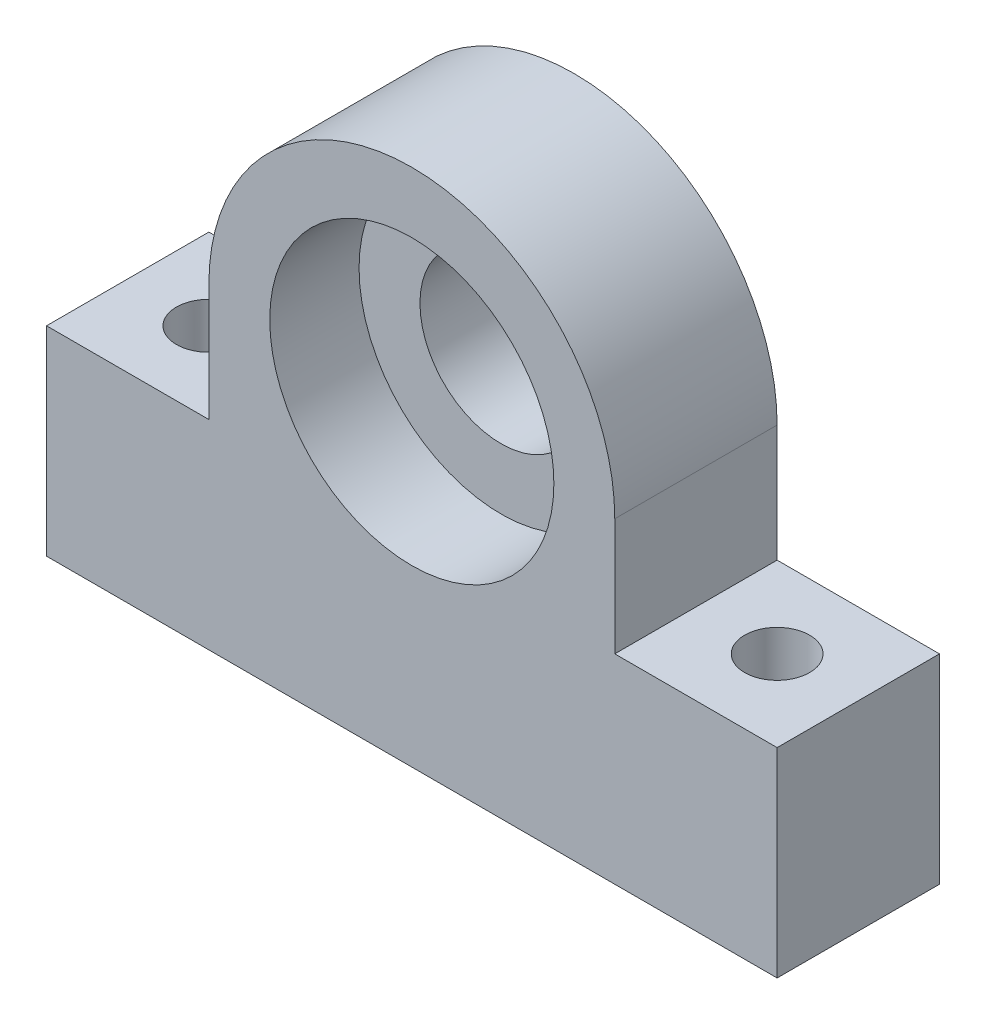
ISO-10303-21;
HEADER;
FILE_DESCRIPTION(('STEP AP214'),'2;1');
FILE_NAME('part.step','',(''),(''),'','','');
FILE_SCHEMA(('AUTOMOTIVE_DESIGN { 1 0 10303 214 1 1 1 1 }'));
ENDSEC;
DATA;
#1=APPLICATION_CONTEXT('core data for automotive mechanical design processes');
#2=APPLICATION_PROTOCOL_DEFINITION('international standard','automotive_design',2000,#1);
#3=PRODUCT_CONTEXT('',#1,'mechanical');
#4=PRODUCT('Part','Part','',(#3));
#5=PRODUCT_RELATED_PRODUCT_CATEGORY('part','',(#4));
#6=PRODUCT_DEFINITION_FORMATION('','',#4);
#7=PRODUCT_DEFINITION_CONTEXT('part definition',#1,'design');
#8=PRODUCT_DEFINITION('design','',#6,#7);
#9=PRODUCT_DEFINITION_SHAPE('','',#8);
#10=(LENGTH_UNIT() NAMED_UNIT(*) SI_UNIT(.MILLI.,.METRE.));
#11=(NAMED_UNIT(*) PLANE_ANGLE_UNIT() SI_UNIT($,.RADIAN.));
#12=(NAMED_UNIT(*) SI_UNIT($,.STERADIAN.) SOLID_ANGLE_UNIT());
#13=UNCERTAINTY_MEASURE_WITH_UNIT(LENGTH_MEASURE(1.E-05),#10,'distance_accuracy_value','');
#14=(GEOMETRIC_REPRESENTATION_CONTEXT(3) GLOBAL_UNCERTAINTY_ASSIGNED_CONTEXT((#13)) GLOBAL_UNIT_ASSIGNED_CONTEXT((#10,
#11,#12)) REPRESENTATION_CONTEXT('',''));
#15=CARTESIAN_POINT('',(0.,0.,0.));
#16=DIRECTION('',(0.,0.,1.));
#17=DIRECTION('',(1.,0.,0.));
#18=AXIS2_PLACEMENT_3D('',#15,#16,#17);
#19=CARTESIAN_POINT('',(0.,0.,20.));
#20=DIRECTION('',(0.,0.,-1.));
#21=DIRECTION('',(-1.,0.,0.));
#22=AXIS2_PLACEMENT_3D('',#19,#20,#21);
#23=CYLINDRICAL_SURFACE('',#22,17.5);
#24=CARTESIAN_POINT('',(0.,0.,20.));
#25=DIRECTION('',(0.,0.,1.));
#26=DIRECTION('',(1.,0.,0.));
#27=AXIS2_PLACEMENT_3D('',#24,#25,#26);
#28=CIRCLE('',#27,17.5);
#29=CARTESIAN_POINT('',(17.5,0.,20.));
#30=VERTEX_POINT('',#29);
#31=EDGE_CURVE('E159',#30,#30,#28,.T.);
#32=ORIENTED_EDGE('',*,*,#31,.T.);
#33=EDGE_LOOP('',(#32));
#34=FACE_BOUND('',#33,.T.);
#35=CARTESIAN_POINT('',(0.,0.,9.));
#36=DIRECTION('',(0.,0.,-1.));
#37=DIRECTION('',(-1.,0.,0.));
#38=AXIS2_PLACEMENT_3D('',#35,#36,#37);
#39=CIRCLE('',#38,17.5);
#40=CARTESIAN_POINT('',(-17.5,0.,9.));
#41=VERTEX_POINT('',#40);
#42=EDGE_CURVE('E143',#41,#41,#39,.T.);
#43=ORIENTED_EDGE('',*,*,#42,.T.);
#44=EDGE_LOOP('',(#43));
#45=FACE_BOUND('',#44,.T.);
#46=ADVANCED_FACE('F37',(#34,#45),#23,.F.);
#47=CARTESIAN_POINT('',(0.,0.,20.));
#48=DIRECTION('',(0.,0.,1.));
#49=DIRECTION('',(1.,0.,0.));
#50=AXIS2_PLACEMENT_3D('',#47,#48,#49);
#51=PLANE('',#50);
#52=CARTESIAN_POINT('',(0.,0.,20.));
#53=DIRECTION('',(0.,0.,1.));
#54=DIRECTION('',(1.,0.,0.));
#55=AXIS2_PLACEMENT_3D('',#52,#53,#54);
#56=CIRCLE('',#55,25.);
#57=CARTESIAN_POINT('',(25.,0.,20.));
#58=VERTEX_POINT('',#57);
#59=CARTESIAN_POINT('',(-25.,0.,20.));
#60=VERTEX_POINT('',#59);
#61=EDGE_CURVE('E11',#58,#60,#56,.T.);
#62=ORIENTED_EDGE('',*,*,#61,.T.);
#63=DIRECTION('',(0.,-1.,0.));
#64=VECTOR('',#63,1.);
#65=CARTESIAN_POINT('',(-25.,-14.4112582686057,20.));
#66=LINE('',#65,#64);
#67=CARTESIAN_POINT('',(-25.,-14.4112582686057,20.));
#68=VERTEX_POINT('',#67);
#69=EDGE_CURVE('E139',#60,#68,#66,.T.);
#70=ORIENTED_EDGE('',*,*,#69,.T.);
#71=DIRECTION('',(-1.,0.,0.));
#72=VECTOR('',#71,1.);
#73=CARTESIAN_POINT('',(-45.,-14.4112582686057,20.));
#74=LINE('',#73,#72);
#75=CARTESIAN_POINT('',(-45.,-14.4112582686057,20.));
#76=VERTEX_POINT('',#75);
#77=EDGE_CURVE('E142',#68,#76,#74,.T.);
#78=ORIENTED_EDGE('',*,*,#77,.T.);
#79=DIRECTION('',(0.,-1.,0.));
#80=VECTOR('',#79,1.);
#81=CARTESIAN_POINT('',(-45.,-38.9912582686057,20.));
#82=LINE('',#81,#80);
#83=CARTESIAN_POINT('',(-45.,-38.9912582686057,20.));
#84=VERTEX_POINT('',#83);
#85=EDGE_CURVE('E146',#76,#84,#82,.T.);
#86=ORIENTED_EDGE('',*,*,#85,.T.);
#87=DIRECTION('',(1.,0.,0.));
#88=VECTOR('',#87,1.);
#89=CARTESIAN_POINT('',(45.,-38.9912582686057,20.));
#90=LINE('',#89,#88);
#91=CARTESIAN_POINT('',(45.,-38.9912582686057,20.));
#92=VERTEX_POINT('',#91);
#93=EDGE_CURVE('E149',#84,#92,#90,.T.);
#94=ORIENTED_EDGE('',*,*,#93,.T.);
#95=DIRECTION('',(0.,1.,0.));
#96=VECTOR('',#95,1.);
#97=CARTESIAN_POINT('',(45.,-14.4112582686057,20.));
#98=LINE('',#97,#96);
#99=CARTESIAN_POINT('',(45.,-14.4112582686057,20.));
#100=VERTEX_POINT('',#99);
#101=EDGE_CURVE('E152',#92,#100,#98,.T.);
#102=ORIENTED_EDGE('',*,*,#101,.T.);
#103=DIRECTION('',(-1.,0.,0.));
#104=VECTOR('',#103,1.);
#105=CARTESIAN_POINT('',(25.,-14.4112582686057,20.));
#106=LINE('',#105,#104);
#107=CARTESIAN_POINT('',(25.,-14.4112582686057,20.));
#108=VERTEX_POINT('',#107);
#109=EDGE_CURVE('E115',#100,#108,#106,.T.);
#110=ORIENTED_EDGE('',*,*,#109,.T.);
#111=DIRECTION('',(0.,1.,0.));
#112=VECTOR('',#111,1.);
#113=CARTESIAN_POINT('',(25.,0.,20.));
#114=LINE('',#113,#112);
#115=EDGE_CURVE('E53',#108,#58,#114,.T.);
#116=ORIENTED_EDGE('',*,*,#115,.T.);
#117=EDGE_LOOP('',(#62,#70,#78,#86,#94,#102,#110,#116));
#118=FACE_BOUND('',#117,.T.);
#119=ORIENTED_EDGE('',*,*,#31,.F.);
#120=EDGE_LOOP('',(#119));
#121=FACE_BOUND('',#120,.T.);
#122=ADVANCED_FACE('F214',(#118,#121),#51,.T.);
#123=CARTESIAN_POINT('',(0.,0.,0.));
#124=DIRECTION('',(0.,0.,1.));
#125=DIRECTION('',(1.,0.,0.));
#126=AXIS2_PLACEMENT_3D('',#123,#124,#125);
#127=PLANE('',#126);
#128=CARTESIAN_POINT('',(0.,0.,0.));
#129=DIRECTION('',(0.,0.,1.));
#130=DIRECTION('',(1.,0.,0.));
#131=AXIS2_PLACEMENT_3D('',#128,#129,#130);
#132=CIRCLE('',#131,25.);
#133=CARTESIAN_POINT('',(25.,0.,0.));
#134=VERTEX_POINT('',#133);
#135=CARTESIAN_POINT('',(-25.,0.,0.));
#136=VERTEX_POINT('',#135);
#137=EDGE_CURVE('E46',#134,#136,#132,.T.);
#138=ORIENTED_EDGE('',*,*,#137,.F.);
#139=DIRECTION('',(0.,1.,0.));
#140=VECTOR('',#139,1.);
#141=CARTESIAN_POINT('',(25.,0.,0.));
#142=LINE('',#141,#140);
#143=CARTESIAN_POINT('',(25.,-14.4112582686057,0.));
#144=VERTEX_POINT('',#143);
#145=EDGE_CURVE('E61',#144,#134,#142,.T.);
#146=ORIENTED_EDGE('',*,*,#145,.F.);
#147=DIRECTION('',(-1.,0.,0.));
#148=VECTOR('',#147,1.);
#149=CARTESIAN_POINT('',(25.,-14.4112582686057,0.));
#150=LINE('',#149,#148);
#151=CARTESIAN_POINT('',(45.,-14.4112582686057,0.));
#152=VERTEX_POINT('',#151);
#153=EDGE_CURVE('E114',#152,#144,#150,.T.);
#154=ORIENTED_EDGE('',*,*,#153,.F.);
#155=DIRECTION('',(0.,1.,0.));
#156=VECTOR('',#155,1.);
#157=CARTESIAN_POINT('',(45.,-14.4112582686057,0.));
#158=LINE('',#157,#156);
#159=CARTESIAN_POINT('',(45.,-38.9912582686057,0.));
#160=VERTEX_POINT('',#159);
#161=EDGE_CURVE('E128',#160,#152,#158,.T.);
#162=ORIENTED_EDGE('',*,*,#161,.F.);
#163=DIRECTION('',(1.,0.,0.));
#164=VECTOR('',#163,1.);
#165=CARTESIAN_POINT('',(45.,-38.9912582686057,0.));
#166=LINE('',#165,#164);
#167=CARTESIAN_POINT('',(-45.,-38.9912582686057,0.));
#168=VERTEX_POINT('',#167);
#169=EDGE_CURVE('E132',#168,#160,#166,.T.);
#170=ORIENTED_EDGE('',*,*,#169,.F.);
#171=DIRECTION('',(0.,-1.,0.));
#172=VECTOR('',#171,1.);
#173=CARTESIAN_POINT('',(-45.,-38.9912582686057,0.));
#174=LINE('',#173,#172);
#175=CARTESIAN_POINT('',(-45.,-14.4112582686057,0.));
#176=VERTEX_POINT('',#175);
#177=EDGE_CURVE('E134',#176,#168,#174,.T.);
#178=ORIENTED_EDGE('',*,*,#177,.F.);
#179=DIRECTION('',(-1.,0.,0.));
#180=VECTOR('',#179,1.);
#181=CARTESIAN_POINT('',(-45.,-14.4112582686057,0.));
#182=LINE('',#181,#180);
#183=CARTESIAN_POINT('',(-25.,-14.4112582686057,0.));
#184=VERTEX_POINT('',#183);
#185=EDGE_CURVE('E188',#184,#176,#182,.T.);
#186=ORIENTED_EDGE('',*,*,#185,.F.);
#187=DIRECTION('',(0.,-1.,0.));
#188=VECTOR('',#187,1.);
#189=CARTESIAN_POINT('',(-25.,-14.4112582686057,0.));
#190=LINE('',#189,#188);
#191=EDGE_CURVE('E156',#136,#184,#190,.T.);
#192=ORIENTED_EDGE('',*,*,#191,.F.);
#193=EDGE_LOOP('',(#138,#146,#154,#162,#170,#178,#186,#192));
#194=FACE_BOUND('',#193,.T.);
#195=CARTESIAN_POINT('',(0.,0.,0.));
#196=DIRECTION('',(0.,0.,-1.));
#197=DIRECTION('',(-1.,0.,0.));
#198=AXIS2_PLACEMENT_3D('',#195,#196,#197);
#199=CIRCLE('',#198,10.);
#200=CARTESIAN_POINT('',(-10.,0.,0.));
#201=VERTEX_POINT('',#200);
#202=EDGE_CURVE('E177',#201,#201,#199,.T.);
#203=ORIENTED_EDGE('',*,*,#202,.F.);
#204=EDGE_LOOP('',(#203));
#205=FACE_BOUND('',#204,.T.);
#206=ADVANCED_FACE('F125',(#194,#205),#127,.F.);
#207=CARTESIAN_POINT('',(0.,0.,20.));
#208=DIRECTION('',(0.,0.,-1.));
#209=DIRECTION('',(-1.,0.,0.));
#210=AXIS2_PLACEMENT_3D('',#207,#208,#209);
#211=CYLINDRICAL_SURFACE('',#210,25.);
#212=ORIENTED_EDGE('',*,*,#61,.F.);
#213=DIRECTION('',(0.,0.,1.));
#214=VECTOR('',#213,1.);
#215=CARTESIAN_POINT('',(25.,0.,0.));
#216=LINE('',#215,#214);
#217=EDGE_CURVE('E157',#134,#58,#216,.T.);
#218=ORIENTED_EDGE('',*,*,#217,.F.);
#219=ORIENTED_EDGE('',*,*,#137,.T.);
#220=DIRECTION('',(0.,0.,1.));
#221=VECTOR('',#220,1.);
#222=CARTESIAN_POINT('',(-25.,0.,0.));
#223=LINE('',#222,#221);
#224=EDGE_CURVE('E97',#136,#60,#223,.T.);
#225=ORIENTED_EDGE('',*,*,#224,.T.);
#226=EDGE_LOOP('',(#212,#218,#219,#225));
#227=FACE_BOUND('',#226,.T.);
#228=ADVANCED_FACE('F39',(#227),#211,.T.);
#229=CARTESIAN_POINT('',(25.,0.,0.));
#230=DIRECTION('',(1.,0.,0.));
#231=DIRECTION('',(0.,1.,0.));
#232=AXIS2_PLACEMENT_3D('',#229,#230,#231);
#233=PLANE('',#232);
#234=ORIENTED_EDGE('',*,*,#115,.F.);
#235=DIRECTION('',(0.,0.,1.));
#236=VECTOR('',#235,1.);
#237=CARTESIAN_POINT('',(25.,-14.4112582686057,0.));
#238=LINE('',#237,#236);
#239=EDGE_CURVE('E90',#144,#108,#238,.T.);
#240=ORIENTED_EDGE('',*,*,#239,.F.);
#241=ORIENTED_EDGE('',*,*,#145,.T.);
#242=ORIENTED_EDGE('',*,*,#217,.T.);
#243=EDGE_LOOP('',(#234,#240,#241,#242));
#244=FACE_BOUND('',#243,.T.);
#245=ADVANCED_FACE('F203',(#244),#233,.T.);
#246=CARTESIAN_POINT('',(25.,-14.4112582686057,0.));
#247=DIRECTION('',(0.,1.,0.));
#248=DIRECTION('',(0.,0.,1.));
#249=AXIS2_PLACEMENT_3D('',#246,#247,#248);
#250=PLANE('',#249);
#251=CARTESIAN_POINT('',(35.,-14.4112582686057,10.));
#252=DIRECTION('',(0.,1.,0.));
#253=DIRECTION('',(0.,0.,1.));
#254=AXIS2_PLACEMENT_3D('',#251,#252,#253);
#255=CIRCLE('',#254,4.00000000000001);
#256=CARTESIAN_POINT('',(35.,-14.4112582686057,14.));
#257=VERTEX_POINT('',#256);
#258=EDGE_CURVE('E382',#257,#257,#255,.T.);
#259=ORIENTED_EDGE('',*,*,#258,.F.);
#260=EDGE_LOOP('',(#259));
#261=FACE_BOUND('',#260,.T.);
#262=ORIENTED_EDGE('',*,*,#109,.F.);
#263=DIRECTION('',(0.,0.,1.));
#264=VECTOR('',#263,1.);
#265=CARTESIAN_POINT('',(45.,-14.4112582686057,0.));
#266=LINE('',#265,#264);
#267=EDGE_CURVE('E111',#152,#100,#266,.T.);
#268=ORIENTED_EDGE('',*,*,#267,.F.);
#269=ORIENTED_EDGE('',*,*,#153,.T.);
#270=ORIENTED_EDGE('',*,*,#239,.T.);
#271=EDGE_LOOP('',(#262,#268,#269,#270));
#272=FACE_BOUND('',#271,.T.);
#273=ADVANCED_FACE('F113',(#261,#272),#250,.T.);
#274=CARTESIAN_POINT('',(45.,-14.4112582686057,0.));
#275=DIRECTION('',(1.,0.,0.));
#276=DIRECTION('',(0.,0.,-1.));
#277=AXIS2_PLACEMENT_3D('',#274,#275,#276);
#278=PLANE('',#277);
#279=ORIENTED_EDGE('',*,*,#101,.F.);
#280=DIRECTION('',(0.,0.,1.));
#281=VECTOR('',#280,1.);
#282=CARTESIAN_POINT('',(45.,-38.9912582686057,0.));
#283=LINE('',#282,#281);
#284=EDGE_CURVE('E120',#160,#92,#283,.T.);
#285=ORIENTED_EDGE('',*,*,#284,.F.);
#286=ORIENTED_EDGE('',*,*,#161,.T.);
#287=ORIENTED_EDGE('',*,*,#267,.T.);
#288=EDGE_LOOP('',(#279,#285,#286,#287));
#289=FACE_BOUND('',#288,.T.);
#290=ADVANCED_FACE('F131',(#289),#278,.T.);
#291=CARTESIAN_POINT('',(45.,-38.9912582686057,0.));
#292=DIRECTION('',(0.,-1.,0.));
#293=DIRECTION('',(1.,0.,0.));
#294=AXIS2_PLACEMENT_3D('',#291,#292,#293);
#295=PLANE('',#294);
#296=CARTESIAN_POINT('',(35.,-38.9912582686057,10.));
#297=DIRECTION('',(0.,-1.,0.));
#298=DIRECTION('',(1.,0.,0.));
#299=AXIS2_PLACEMENT_3D('',#296,#297,#298);
#300=CIRCLE('',#299,4.00000000000001);
#301=CARTESIAN_POINT('',(39.,-38.9912582686057,10.));
#302=VERTEX_POINT('',#301);
#303=EDGE_CURVE('E41',#302,#302,#300,.T.);
#304=ORIENTED_EDGE('',*,*,#303,.F.);
#305=EDGE_LOOP('',(#304));
#306=FACE_BOUND('',#305,.T.);
#307=CARTESIAN_POINT('',(-35.,-38.9912582686057,10.));
#308=DIRECTION('',(0.,-1.,0.));
#309=DIRECTION('',(1.,0.,0.));
#310=AXIS2_PLACEMENT_3D('',#307,#308,#309);
#311=CIRCLE('',#310,4.00000000000001);
#312=CARTESIAN_POINT('',(-31.,-38.9912582686057,10.));
#313=VERTEX_POINT('',#312);
#314=EDGE_CURVE('E184',#313,#313,#311,.T.);
#315=ORIENTED_EDGE('',*,*,#314,.F.);
#316=EDGE_LOOP('',(#315));
#317=FACE_BOUND('',#316,.T.);
#318=ORIENTED_EDGE('',*,*,#93,.F.);
#319=DIRECTION('',(0.,0.,1.));
#320=VECTOR('',#319,1.);
#321=CARTESIAN_POINT('',(-45.,-38.9912582686057,0.));
#322=LINE('',#321,#320);
#323=EDGE_CURVE('E162',#168,#84,#322,.T.);
#324=ORIENTED_EDGE('',*,*,#323,.F.);
#325=ORIENTED_EDGE('',*,*,#169,.T.);
#326=ORIENTED_EDGE('',*,*,#284,.T.);
#327=EDGE_LOOP('',(#318,#324,#325,#326));
#328=FACE_BOUND('',#327,.T.);
#329=ADVANCED_FACE('F253',(#306,#317,#328),#295,.T.);
#330=CARTESIAN_POINT('',(-45.,-38.9912582686057,0.));
#331=DIRECTION('',(-1.,0.,0.));
#332=DIRECTION('',(0.,-1.,0.));
#333=AXIS2_PLACEMENT_3D('',#330,#331,#332);
#334=PLANE('',#333);
#335=ORIENTED_EDGE('',*,*,#85,.F.);
#336=DIRECTION('',(0.,0.,1.));
#337=VECTOR('',#336,1.);
#338=CARTESIAN_POINT('',(-45.,-14.4112582686057,0.));
#339=LINE('',#338,#337);
#340=EDGE_CURVE('E164',#176,#76,#339,.T.);
#341=ORIENTED_EDGE('',*,*,#340,.F.);
#342=ORIENTED_EDGE('',*,*,#177,.T.);
#343=ORIENTED_EDGE('',*,*,#323,.T.);
#344=EDGE_LOOP('',(#335,#341,#342,#343));
#345=FACE_BOUND('',#344,.T.);
#346=ADVANCED_FACE('F194',(#345),#334,.T.);
#347=CARTESIAN_POINT('',(-45.,-14.4112582686057,0.));
#348=DIRECTION('',(0.,1.,0.));
#349=DIRECTION('',(0.,0.,1.));
#350=AXIS2_PLACEMENT_3D('',#347,#348,#349);
#351=PLANE('',#350);
#352=CARTESIAN_POINT('',(-35.,-14.4112582686057,10.));
#353=DIRECTION('',(0.,1.,0.));
#354=DIRECTION('',(0.,0.,-1.));
#355=AXIS2_PLACEMENT_3D('',#352,#353,#354);
#356=CIRCLE('',#355,4.00000000000001);
#357=CARTESIAN_POINT('',(-35.,-14.4112582686057,5.99999999999999));
#358=VERTEX_POINT('',#357);
#359=EDGE_CURVE('E384',#358,#358,#356,.T.);
#360=ORIENTED_EDGE('',*,*,#359,.F.);
#361=EDGE_LOOP('',(#360));
#362=FACE_BOUND('',#361,.T.);
#363=ORIENTED_EDGE('',*,*,#77,.F.);
#364=DIRECTION('',(0.,0.,1.));
#365=VECTOR('',#364,1.);
#366=CARTESIAN_POINT('',(-25.,-14.4112582686057,0.));
#367=LINE('',#366,#365);
#368=EDGE_CURVE('E166',#184,#68,#367,.T.);
#369=ORIENTED_EDGE('',*,*,#368,.F.);
#370=ORIENTED_EDGE('',*,*,#185,.T.);
#371=ORIENTED_EDGE('',*,*,#340,.T.);
#372=EDGE_LOOP('',(#363,#369,#370,#371));
#373=FACE_BOUND('',#372,.T.);
#374=ADVANCED_FACE('F199',(#362,#373),#351,.T.);
#375=CARTESIAN_POINT('',(-25.,-14.4112582686057,0.));
#376=DIRECTION('',(-1.,0.,0.));
#377=DIRECTION('',(0.,-1.,0.));
#378=AXIS2_PLACEMENT_3D('',#375,#376,#377);
#379=PLANE('',#378);
#380=ORIENTED_EDGE('',*,*,#69,.F.);
#381=ORIENTED_EDGE('',*,*,#224,.F.);
#382=ORIENTED_EDGE('',*,*,#191,.T.);
#383=ORIENTED_EDGE('',*,*,#368,.T.);
#384=EDGE_LOOP('',(#380,#381,#382,#383));
#385=FACE_BOUND('',#384,.T.);
#386=ADVANCED_FACE('F200',(#385),#379,.T.);
#387=CARTESIAN_POINT('',(0.,0.,9.));
#388=DIRECTION('',(0.,0.,-1.));
#389=DIRECTION('',(-1.,0.,0.));
#390=AXIS2_PLACEMENT_3D('',#387,#388,#389);
#391=PLANE('',#390);
#392=CARTESIAN_POINT('',(0.,0.,9.));
#393=DIRECTION('',(0.,0.,-1.));
#394=DIRECTION('',(-1.,0.,0.));
#395=AXIS2_PLACEMENT_3D('',#392,#393,#394);
#396=CIRCLE('',#395,10.);
#397=CARTESIAN_POINT('',(-10.,0.,9.));
#398=VERTEX_POINT('',#397);
#399=EDGE_CURVE('E173',#398,#398,#396,.T.);
#400=ORIENTED_EDGE('',*,*,#399,.T.);
#401=EDGE_LOOP('',(#400));
#402=FACE_BOUND('',#401,.T.);
#403=ORIENTED_EDGE('',*,*,#42,.F.);
#404=EDGE_LOOP('',(#403));
#405=FACE_BOUND('',#404,.T.);
#406=ADVANCED_FACE('F275',(#402,#405),#391,.F.);
#407=CARTESIAN_POINT('',(0.,0.,9.));
#408=DIRECTION('',(0.,0.,-1.));
#409=DIRECTION('',(-1.,0.,0.));
#410=AXIS2_PLACEMENT_3D('',#407,#408,#409);
#411=CYLINDRICAL_SURFACE('',#410,10.);
#412=ORIENTED_EDGE('',*,*,#399,.F.);
#413=EDGE_LOOP('',(#412));
#414=FACE_BOUND('',#413,.T.);
#415=ORIENTED_EDGE('',*,*,#202,.T.);
#416=EDGE_LOOP('',(#415));
#417=FACE_BOUND('',#416,.T.);
#418=ADVANCED_FACE('F293',(#414,#417),#411,.F.);
#419=CARTESIAN_POINT('',(-35.,-44.4112582686057,10.));
#420=DIRECTION('',(0.,1.,0.));
#421=DIRECTION('',(0.,0.,1.));
#422=AXIS2_PLACEMENT_3D('',#419,#420,#421);
#423=CYLINDRICAL_SURFACE('',#422,4.00000000000001);
#424=ORIENTED_EDGE('',*,*,#314,.T.);
#425=EDGE_LOOP('',(#424));
#426=FACE_BOUND('',#425,.T.);
#427=ORIENTED_EDGE('',*,*,#359,.T.);
#428=EDGE_LOOP('',(#427));
#429=FACE_BOUND('',#428,.T.);
#430=ADVANCED_FACE('F300',(#426,#429),#423,.F.);
#431=CARTESIAN_POINT('',(35.,-44.4112582686057,10.));
#432=DIRECTION('',(0.,1.,0.));
#433=DIRECTION('',(0.,0.,1.));
#434=AXIS2_PLACEMENT_3D('',#431,#432,#433);
#435=CYLINDRICAL_SURFACE('',#434,4.00000000000001);
#436=ORIENTED_EDGE('',*,*,#303,.T.);
#437=EDGE_LOOP('',(#436));
#438=FACE_BOUND('',#437,.T.);
#439=ORIENTED_EDGE('',*,*,#258,.T.);
#440=EDGE_LOOP('',(#439));
#441=FACE_BOUND('',#440,.T.);
#442=ADVANCED_FACE('F310',(#438,#441),#435,.F.);
#443=CLOSED_SHELL('',(#46,#122,#206,#228,#245,#273,#290,#329,#346,#374,#386,#406,#418,#430,#442));
#444=MANIFOLD_SOLID_BREP('B2',#443);
#445=ADVANCED_BREP_SHAPE_REPRESENTATION('',(#18,#444),#14);
#446=SHAPE_DEFINITION_REPRESENTATION(#9,#445);
ENDSEC;
END-ISO-10303-21;
